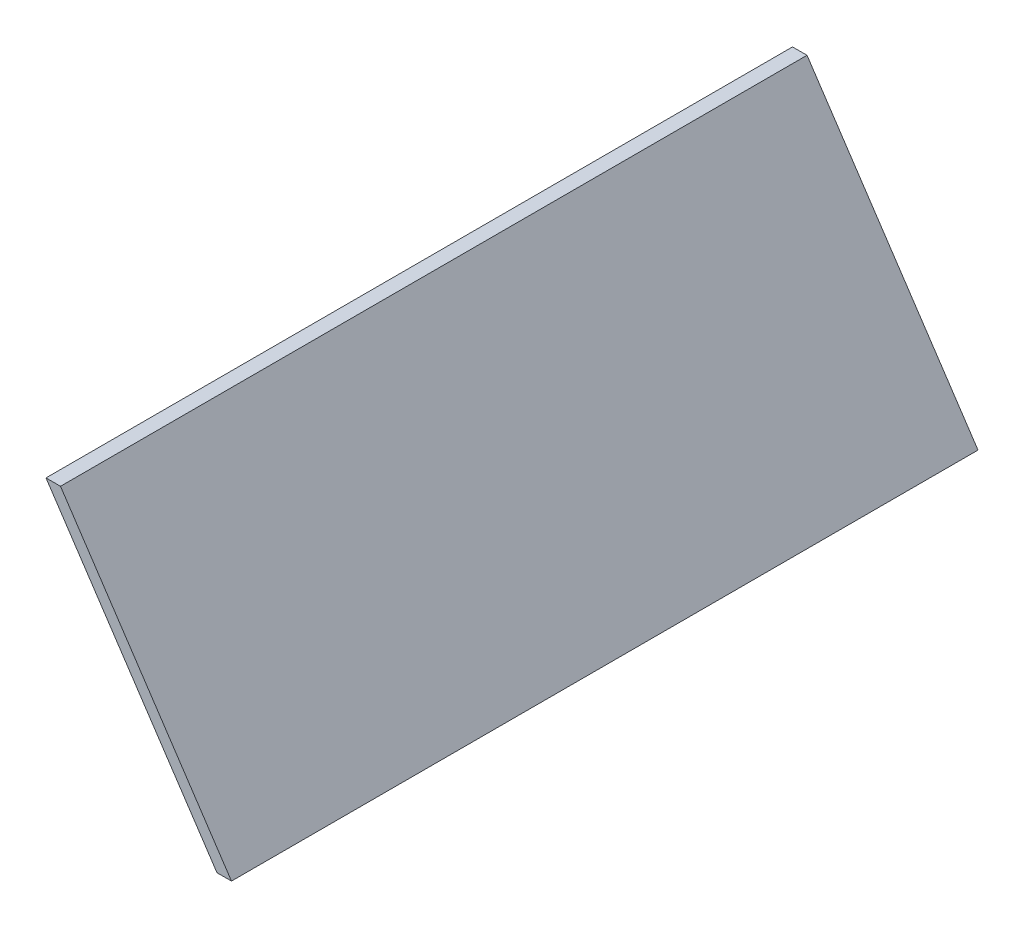
ISO-10303-21;
HEADER;
FILE_DESCRIPTION(('STEP AP214'),'2;1');
FILE_NAME('part.step','',(''),(''),'','','');
FILE_SCHEMA(('AUTOMOTIVE_DESIGN { 1 0 10303 214 1 1 1 1 }'));
ENDSEC;
DATA;
#1=APPLICATION_CONTEXT('core data for automotive mechanical design processes');
#2=APPLICATION_PROTOCOL_DEFINITION('international standard','automotive_design',2000,#1);
#3=PRODUCT_CONTEXT('',#1,'mechanical');
#4=PRODUCT('Part','Part','',(#3));
#5=PRODUCT_RELATED_PRODUCT_CATEGORY('part','',(#4));
#6=PRODUCT_DEFINITION_FORMATION('','',#4);
#7=PRODUCT_DEFINITION_CONTEXT('part definition',#1,'design');
#8=PRODUCT_DEFINITION('design','',#6,#7);
#9=PRODUCT_DEFINITION_SHAPE('','',#8);
#10=(LENGTH_UNIT() NAMED_UNIT(*) SI_UNIT(.MILLI.,.METRE.));
#11=(NAMED_UNIT(*) PLANE_ANGLE_UNIT() SI_UNIT($,.RADIAN.));
#12=(NAMED_UNIT(*) SI_UNIT($,.STERADIAN.) SOLID_ANGLE_UNIT());
#13=UNCERTAINTY_MEASURE_WITH_UNIT(LENGTH_MEASURE(1.E-05),#10,'distance_accuracy_value','');
#14=(GEOMETRIC_REPRESENTATION_CONTEXT(3) GLOBAL_UNCERTAINTY_ASSIGNED_CONTEXT((#13)) GLOBAL_UNIT_ASSIGNED_CONTEXT((#10,
#11,#12)) REPRESENTATION_CONTEXT('',''));
#15=CARTESIAN_POINT('',(0.,0.,0.));
#16=DIRECTION('',(0.,0.,1.));
#17=DIRECTION('',(1.,0.,0.));
#18=AXIS2_PLACEMENT_3D('',#15,#16,#17);
#19=CARTESIAN_POINT('',(-148.070819622104,-85.81507807446,277.48));
#20=DIRECTION('',(0.,1.,0.));
#21=DIRECTION('',(0.,0.,1.));
#22=AXIS2_PLACEMENT_3D('',#19,#20,#21);
#23=PLANE('',#22);
#24=DIRECTION('',(1.,0.,0.));
#25=VECTOR('',#24,1.);
#26=CARTESIAN_POINT('',(-148.070819622104,-85.81507807446,0.));
#27=LINE('',#26,#25);
#28=CARTESIAN_POINT('',(-148.070819622104,-85.81507807446,0.));
#29=VERTEX_POINT('',#28);
#30=CARTESIAN_POINT('',(-142.680341112104,-85.81507807446,0.));
#31=VERTEX_POINT('',#30);
#32=EDGE_CURVE('E107',#29,#31,#27,.T.);
#33=ORIENTED_EDGE('',*,*,#32,.T.);
#34=DIRECTION('',(0.,0.,-1.));
#35=VECTOR('',#34,1.);
#36=CARTESIAN_POINT('',(-142.680341112104,-85.81507807446,277.48));
#37=LINE('',#36,#35);
#38=CARTESIAN_POINT('',(-142.680341112104,-85.81507807446,277.48));
#39=VERTEX_POINT('',#38);
#40=EDGE_CURVE('E11',#39,#31,#37,.T.);
#41=ORIENTED_EDGE('',*,*,#40,.F.);
#42=DIRECTION('',(1.,0.,0.));
#43=VECTOR('',#42,1.);
#44=CARTESIAN_POINT('',(-148.070819622104,-85.81507807446,277.48));
#45=LINE('',#44,#43);
#46=CARTESIAN_POINT('',(-148.070819622104,-85.81507807446,277.48));
#47=VERTEX_POINT('',#46);
#48=EDGE_CURVE('E85',#47,#39,#45,.T.);
#49=ORIENTED_EDGE('',*,*,#48,.F.);
#50=DIRECTION('',(0.,0.,-1.));
#51=VECTOR('',#50,1.);
#52=CARTESIAN_POINT('',(-148.070819622104,-85.81507807446,277.48));
#53=LINE('',#52,#51);
#54=EDGE_CURVE('E103',#47,#29,#53,.T.);
#55=ORIENTED_EDGE('',*,*,#54,.T.);
#56=EDGE_LOOP('',(#33,#41,#49,#55));
#57=FACE_BOUND('',#56,.T.);
#58=ADVANCED_FACE('F43',(#57),#23,.F.);
#59=CARTESIAN_POINT('',(-190.272105908113,-14.4272485898775,277.48));
#60=DIRECTION('',(-0.832050948079556,-0.554699215611409,0.));
#61=DIRECTION('',(0.554699215611409,-0.832050948079556,0.));
#62=AXIS2_PLACEMENT_3D('',#59,#60,#61);
#63=PLANE('',#62);
#64=DIRECTION('',(-0.554699215611409,0.832050948079556,0.));
#65=VECTOR('',#64,1.);
#66=CARTESIAN_POINT('',(-190.272105908113,-14.4272485898775,0.));
#67=LINE('',#66,#65);
#68=CARTESIAN_POINT('',(-206.228479266631,9.50737256554003,0.));
#69=VERTEX_POINT('',#68);
#70=EDGE_CURVE('E97',#31,#69,#67,.T.);
#71=ORIENTED_EDGE('',*,*,#70,.T.);
#72=DIRECTION('',(0.,0.,-1.));
#73=VECTOR('',#72,1.);
#74=CARTESIAN_POINT('',(-206.228479266631,9.50737256554003,277.48));
#75=LINE('',#74,#73);
#76=CARTESIAN_POINT('',(-206.228479266631,9.50737256554003,277.48));
#77=VERTEX_POINT('',#76);
#78=EDGE_CURVE('E51',#77,#69,#75,.T.);
#79=ORIENTED_EDGE('',*,*,#78,.F.);
#80=DIRECTION('',(0.554699215611404,-0.832050948079559,0.));
#81=VECTOR('',#80,1.);
#82=CARTESIAN_POINT('',(-190.272105908113,-14.4272485898775,277.48));
#83=LINE('',#82,#81);
#84=EDGE_CURVE('E88',#77,#39,#83,.T.);
#85=ORIENTED_EDGE('',*,*,#84,.T.);
#86=ORIENTED_EDGE('',*,*,#40,.T.);
#87=EDGE_LOOP('',(#71,#79,#85,#86));
#88=FACE_BOUND('',#87,.T.);
#89=ADVANCED_FACE('F96',(#88),#63,.F.);
#90=CARTESIAN_POINT('',(-211.618957776631,9.50737256554003,277.48));
#91=DIRECTION('',(0.,1.,0.));
#92=DIRECTION('',(-1.,0.,0.));
#93=AXIS2_PLACEMENT_3D('',#90,#91,#92);
#94=PLANE('',#93);
#95=DIRECTION('',(1.,0.,0.));
#96=VECTOR('',#95,1.);
#97=CARTESIAN_POINT('',(-211.618957776631,9.50737256554003,0.));
#98=LINE('',#97,#96);
#99=CARTESIAN_POINT('',(-211.618957776631,9.50737256554003,0.));
#100=VERTEX_POINT('',#99);
#101=EDGE_CURVE('E111',#100,#69,#98,.T.);
#102=ORIENTED_EDGE('',*,*,#101,.F.);
#103=DIRECTION('',(0.,0.,-1.));
#104=VECTOR('',#103,1.);
#105=CARTESIAN_POINT('',(-211.618957776631,9.50737256554003,277.48));
#106=LINE('',#105,#104);
#107=CARTESIAN_POINT('',(-211.618957776631,9.50737256554003,277.48));
#108=VERTEX_POINT('',#107);
#109=EDGE_CURVE('E100',#108,#100,#106,.T.);
#110=ORIENTED_EDGE('',*,*,#109,.F.);
#111=DIRECTION('',(1.,0.,0.));
#112=VECTOR('',#111,1.);
#113=CARTESIAN_POINT('',(-211.618957776631,9.50737256554003,277.48));
#114=LINE('',#113,#112);
#115=EDGE_CURVE('E92',#108,#77,#114,.T.);
#116=ORIENTED_EDGE('',*,*,#115,.T.);
#117=ORIENTED_EDGE('',*,*,#78,.T.);
#118=EDGE_LOOP('',(#102,#110,#116,#117));
#119=FACE_BOUND('',#118,.T.);
#120=ADVANCED_FACE('F101',(#119),#94,.T.);
#121=CARTESIAN_POINT('',(-194.892333821917,-15.58262743446,277.48));
#122=DIRECTION('',(0.832050948079559,0.554699215611404,0.));
#123=DIRECTION('',(-0.554699215611404,0.832050948079559,0.));
#124=AXIS2_PLACEMENT_3D('',#121,#122,#123);
#125=PLANE('',#124);
#126=DIRECTION('',(0.554699215611404,-0.832050948079559,0.));
#127=VECTOR('',#126,1.);
#128=CARTESIAN_POINT('',(-194.892333821917,-15.58262743446,0.));
#129=LINE('',#128,#127);
#130=EDGE_CURVE('E77',#100,#29,#129,.T.);
#131=ORIENTED_EDGE('',*,*,#130,.T.);
#132=ORIENTED_EDGE('',*,*,#54,.F.);
#133=DIRECTION('',(-0.554699215611409,0.832050948079556,0.));
#134=VECTOR('',#133,1.);
#135=CARTESIAN_POINT('',(-194.892333821917,-15.58262743446,277.48));
#136=LINE('',#135,#134);
#137=EDGE_CURVE('E59',#47,#108,#136,.T.);
#138=ORIENTED_EDGE('',*,*,#137,.T.);
#139=ORIENTED_EDGE('',*,*,#109,.T.);
#140=EDGE_LOOP('',(#131,#132,#138,#139));
#141=FACE_BOUND('',#140,.T.);
#142=ADVANCED_FACE('F115',(#141),#125,.F.);
#143=CARTESIAN_POINT('',(0.,0.,277.48));
#144=DIRECTION('',(0.,0.,-1.));
#145=DIRECTION('',(-1.,0.,0.));
#146=AXIS2_PLACEMENT_3D('',#143,#144,#145);
#147=PLANE('',#146);
#148=ORIENTED_EDGE('',*,*,#48,.T.);
#149=ORIENTED_EDGE('',*,*,#84,.F.);
#150=ORIENTED_EDGE('',*,*,#115,.F.);
#151=ORIENTED_EDGE('',*,*,#137,.F.);
#152=EDGE_LOOP('',(#148,#149,#150,#151));
#153=FACE_BOUND('',#152,.T.);
#154=ADVANCED_FACE('F90',(#153),#147,.F.);
#155=CARTESIAN_POINT('',(0.,0.,0.));
#156=DIRECTION('',(0.,0.,-1.));
#157=DIRECTION('',(-1.,0.,0.));
#158=AXIS2_PLACEMENT_3D('',#155,#156,#157);
#159=PLANE('',#158);
#160=ORIENTED_EDGE('',*,*,#32,.F.);
#161=ORIENTED_EDGE('',*,*,#130,.F.);
#162=ORIENTED_EDGE('',*,*,#101,.T.);
#163=ORIENTED_EDGE('',*,*,#70,.F.);
#164=EDGE_LOOP('',(#160,#161,#162,#163));
#165=FACE_BOUND('',#164,.T.);
#166=ADVANCED_FACE('F116',(#165),#159,.T.);
#167=CLOSED_SHELL('',(#58,#89,#120,#142,#154,#166));
#168=MANIFOLD_SOLID_BREP('B2',#167);
#169=ADVANCED_BREP_SHAPE_REPRESENTATION('',(#18,#168),#14);
#170=SHAPE_DEFINITION_REPRESENTATION(#9,#169);
ENDSEC;
END-ISO-10303-21;
